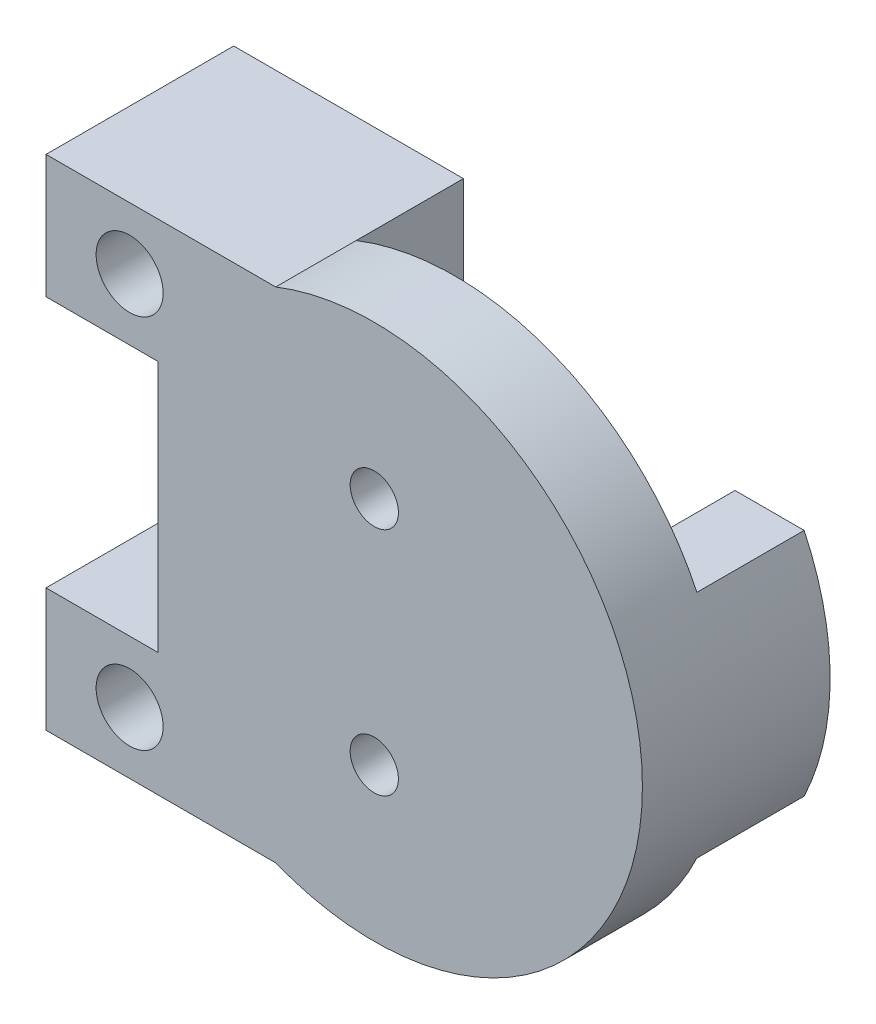
ISO-10303-21;
HEADER;
FILE_DESCRIPTION(('STEP AP214'),'2;1');
FILE_NAME('part.step','',(''),(''),'','','');
FILE_SCHEMA(('AUTOMOTIVE_DESIGN { 1 0 10303 214 1 1 1 1 }'));
ENDSEC;
DATA;
#1=APPLICATION_CONTEXT('core data for automotive mechanical design processes');
#2=APPLICATION_PROTOCOL_DEFINITION('international standard','automotive_design',2000,#1);
#3=PRODUCT_CONTEXT('',#1,'mechanical');
#4=PRODUCT('Part','Part','',(#3));
#5=PRODUCT_RELATED_PRODUCT_CATEGORY('part','',(#4));
#6=PRODUCT_DEFINITION_FORMATION('','',#4);
#7=PRODUCT_DEFINITION_CONTEXT('part definition',#1,'design');
#8=PRODUCT_DEFINITION('design','',#6,#7);
#9=PRODUCT_DEFINITION_SHAPE('','',#8);
#10=(LENGTH_UNIT() NAMED_UNIT(*) SI_UNIT(.MILLI.,.METRE.));
#11=(NAMED_UNIT(*) PLANE_ANGLE_UNIT() SI_UNIT($,.RADIAN.));
#12=(NAMED_UNIT(*) SI_UNIT($,.STERADIAN.) SOLID_ANGLE_UNIT());
#13=UNCERTAINTY_MEASURE_WITH_UNIT(LENGTH_MEASURE(1.E-05),#10,'distance_accuracy_value','');
#14=(GEOMETRIC_REPRESENTATION_CONTEXT(3) GLOBAL_UNCERTAINTY_ASSIGNED_CONTEXT((#13)) GLOBAL_UNIT_ASSIGNED_CONTEXT((#10,
#11,#12)) REPRESENTATION_CONTEXT('',''));
#15=CARTESIAN_POINT('',(0.,0.,0.));
#16=DIRECTION('',(0.,0.,1.));
#17=DIRECTION('',(1.,0.,0.));
#18=AXIS2_PLACEMENT_3D('',#15,#16,#17);
#19=CARTESIAN_POINT('',(-19.6111467499146,27.8877688433513,0.));
#20=DIRECTION('',(0.,0.,1.));
#21=DIRECTION('',(1.,0.,0.));
#22=AXIS2_PLACEMENT_3D('',#19,#20,#21);
#23=PLANE('',#22);
#24=CARTESIAN_POINT('',(-19.6111467499146,23.5877688433513,0.));
#25=DIRECTION('',(0.,0.,1.));
#26=DIRECTION('',(1.,0.,0.));
#27=AXIS2_PLACEMENT_3D('',#24,#25,#26);
#28=CIRCLE('',#27,0.900000000000001);
#29=CARTESIAN_POINT('',(-18.7111467499146,23.5877688433513,0.));
#30=VERTEX_POINT('',#29);
#31=EDGE_CURVE('E380',#30,#30,#28,.T.);
#32=ORIENTED_EDGE('',*,*,#31,.T.);
#33=EDGE_LOOP('',(#32));
#34=FACE_BOUND('',#33,.T.);
#35=CARTESIAN_POINT('',(-19.6111467499146,32.1877688433513,0.));
#36=DIRECTION('',(0.,0.,1.));
#37=DIRECTION('',(1.,0.,0.));
#38=AXIS2_PLACEMENT_3D('',#35,#36,#37);
#39=CIRCLE('',#38,0.9);
#40=CARTESIAN_POINT('',(-18.7111467499146,32.1877688433513,0.));
#41=VERTEX_POINT('',#40);
#42=EDGE_CURVE('E386',#41,#41,#39,.T.);
#43=ORIENTED_EDGE('',*,*,#42,.T.);
#44=EDGE_LOOP('',(#43));
#45=FACE_BOUND('',#44,.T.);
#46=CARTESIAN_POINT('',(-15.2591886094127,23.9877688433513,0.));
#47=DIRECTION('',(0.,0.,1.));
#48=DIRECTION('',(1.,0.,0.));
#49=AXIS2_PLACEMENT_3D('',#46,#47,#48);
#50=CIRCLE('',#49,1.4);
#51=CARTESIAN_POINT('',(-13.8591886094127,23.9877688433513,0.));
#52=VERTEX_POINT('',#51);
#53=EDGE_CURVE('E365',#52,#52,#50,.T.);
#54=ORIENTED_EDGE('',*,*,#53,.T.);
#55=EDGE_LOOP('',(#54));
#56=FACE_BOUND('',#55,.T.);
#57=CARTESIAN_POINT('',(-15.2591886094127,31.7877688433513,0.));
#58=DIRECTION('',(0.,0.,1.));
#59=DIRECTION('',(1.,0.,0.));
#60=AXIS2_PLACEMENT_3D('',#57,#58,#59);
#61=CIRCLE('',#60,1.4);
#62=CARTESIAN_POINT('',(-13.8591886094127,31.7877688433513,0.));
#63=VERTEX_POINT('',#62);
#64=EDGE_CURVE('E359',#63,#63,#61,.T.);
#65=ORIENTED_EDGE('',*,*,#64,.T.);
#66=EDGE_LOOP('',(#65));
#67=FACE_BOUND('',#66,.T.);
#68=DIRECTION('',(-1.,0.,0.));
#69=VECTOR('',#68,1.);
#70=CARTESIAN_POINT('',(-10.5789692824355,23.5959428687848,0.));
#71=LINE('',#70,#69);
#72=CARTESIAN_POINT('',(-10.5789692824355,23.5959428687848,0.));
#73=VERTEX_POINT('',#72);
#74=CARTESIAN_POINT('',(-13.1580289140126,23.5959428687848,0.));
#75=VERTEX_POINT('',#74);
#76=EDGE_CURVE('E683',#73,#75,#71,.T.);
#77=ORIENTED_EDGE('',*,*,#76,.F.);
#78=CARTESIAN_POINT('',(-19.6111467499146,27.8877688433513,0.));
#79=DIRECTION('',(0.,0.,1.));
#80=DIRECTION('',(1.,0.,0.));
#81=AXIS2_PLACEMENT_3D('',#78,#79,#80);
#82=CIRCLE('',#81,10.);
#83=CARTESIAN_POINT('',(-23.2867419398124,18.5877688433513,0.));
#84=VERTEX_POINT('',#83);
#85=EDGE_CURVE('E293',#84,#73,#82,.T.);
#86=ORIENTED_EDGE('',*,*,#85,.F.);
#87=DIRECTION('',(0.,-1.,0.));
#88=VECTOR('',#87,1.);
#89=CARTESIAN_POINT('',(-23.2867419398124,23.1877688433513,0.));
#90=LINE('',#89,#88);
#91=CARTESIAN_POINT('',(-23.2867419398124,23.1877688433513,0.));
#92=VERTEX_POINT('',#91);
#93=EDGE_CURVE('E164',#92,#84,#90,.T.);
#94=ORIENTED_EDGE('',*,*,#93,.F.);
#95=DIRECTION('',(1.,0.,0.));
#96=VECTOR('',#95,1.);
#97=CARTESIAN_POINT('',(-31.8520857071376,23.1877688433513,0.));
#98=LINE('',#97,#96);
#99=CARTESIAN_POINT('',(-24.6102760801051,23.1877688433513,0.));
#100=VERTEX_POINT('',#99);
#101=EDGE_CURVE('E297',#100,#92,#98,.T.);
#102=ORIENTED_EDGE('',*,*,#101,.F.);
#103=CARTESIAN_POINT('',(-25.7591886094127,23.9877688433513,0.));
#104=DIRECTION('',(0.,0.,1.));
#105=DIRECTION('',(1.,0.,0.));
#106=AXIS2_PLACEMENT_3D('',#103,#104,#105);
#107=CIRCLE('',#106,1.4);
#108=CARTESIAN_POINT('',(-26.9081011387203,23.1877688433513,0.));
#109=VERTEX_POINT('',#108);
#110=EDGE_CURVE('E371',#100,#109,#107,.T.);
#111=ORIENTED_EDGE('',*,*,#110,.T.);
#112=CARTESIAN_POINT('',(-27.669115572211,23.1877688433513,0.));
#113=VERTEX_POINT('',#112);
#114=EDGE_CURVE('E315',#113,#109,#98,.T.);
#115=ORIENTED_EDGE('',*,*,#114,.F.);
#116=DIRECTION('',(0.,-1.,0.));
#117=VECTOR('',#116,1.);
#118=CARTESIAN_POINT('',(-27.669115572211,32.5877688433513,0.));
#119=LINE('',#118,#117);
#120=CARTESIAN_POINT('',(-27.669115572211,32.5877688433513,0.));
#121=VERTEX_POINT('',#120);
#122=EDGE_CURVE('E405',#121,#113,#119,.T.);
#123=ORIENTED_EDGE('',*,*,#122,.F.);
#124=DIRECTION('',(-1.,0.,0.));
#125=VECTOR('',#124,1.);
#126=CARTESIAN_POINT('',(-23.2867419398124,32.5877688433513,0.));
#127=LINE('',#126,#125);
#128=CARTESIAN_POINT('',(-26.9081011387203,32.5877688433513,0.));
#129=VERTEX_POINT('',#128);
#130=EDGE_CURVE('E330',#129,#121,#127,.T.);
#131=ORIENTED_EDGE('',*,*,#130,.F.);
#132=CARTESIAN_POINT('',(-25.7591886094127,31.7877688433513,0.));
#133=DIRECTION('',(0.,0.,1.));
#134=DIRECTION('',(1.,0.,0.));
#135=AXIS2_PLACEMENT_3D('',#132,#133,#134);
#136=CIRCLE('',#135,1.4);
#137=CARTESIAN_POINT('',(-24.6102760801051,32.5877688433513,0.));
#138=VERTEX_POINT('',#137);
#139=EDGE_CURVE('E374',#129,#138,#136,.T.);
#140=ORIENTED_EDGE('',*,*,#139,.T.);
#141=CARTESIAN_POINT('',(-23.2867419398124,32.5877688433513,0.));
#142=VERTEX_POINT('',#141);
#143=EDGE_CURVE('E343',#142,#138,#127,.T.);
#144=ORIENTED_EDGE('',*,*,#143,.F.);
#145=DIRECTION('',(0.,-1.,0.));
#146=VECTOR('',#145,1.);
#147=CARTESIAN_POINT('',(-23.2867419398124,37.1877688433513,0.));
#148=LINE('',#147,#146);
#149=CARTESIAN_POINT('',(-23.2867419398124,37.1877688433513,0.));
#150=VERTEX_POINT('',#149);
#151=EDGE_CURVE('E335',#150,#142,#148,.T.);
#152=ORIENTED_EDGE('',*,*,#151,.F.);
#153=CARTESIAN_POINT('',(-10.5789692824355,32.1795948179178,0.));
#154=VERTEX_POINT('',#153);
#155=EDGE_CURVE('E400',#154,#150,#82,.T.);
#156=ORIENTED_EDGE('',*,*,#155,.F.);
#157=DIRECTION('',(1.,0.,0.));
#158=VECTOR('',#157,1.);
#159=CARTESIAN_POINT('',(-10.5789692824356,32.1795948179178,0.));
#160=LINE('',#159,#158);
#161=CARTESIAN_POINT('',(-13.1580289140126,32.1795948179178,0.));
#162=VERTEX_POINT('',#161);
#163=EDGE_CURVE('E289',#162,#154,#160,.T.);
#164=ORIENTED_EDGE('',*,*,#163,.F.);
#165=CARTESIAN_POINT('',(-19.6111467499146,27.8877688433513,0.));
#166=DIRECTION('',(0.,0.,1.));
#167=DIRECTION('',(1.,0.,0.));
#168=AXIS2_PLACEMENT_3D('',#165,#166,#167);
#169=CIRCLE('',#168,7.75);
#170=EDGE_CURVE('E681',#75,#162,#169,.T.);
#171=ORIENTED_EDGE('',*,*,#170,.F.);
#172=EDGE_LOOP('',(#77,#86,#94,#102,#111,#115,#123,#131,#140,#144,#152,#156,#164,#171));
#173=FACE_BOUND('',#172,.T.);
#174=ADVANCED_FACE('F141',(#34,#45,#56,#67,#173),#23,.F.);
#175=CARTESIAN_POINT('',(-25.7591886094127,23.9877688433513,-1.));
#176=DIRECTION('',(0.,0.,1.));
#177=DIRECTION('',(1.,0.,0.));
#178=AXIS2_PLACEMENT_3D('',#175,#176,#177);
#179=CYLINDRICAL_SURFACE('',#178,1.4);
#180=ORIENTED_EDGE('',*,*,#110,.F.);
#181=DIRECTION('',(0.,0.,1.));
#182=VECTOR('',#181,1.);
#183=CARTESIAN_POINT('',(-24.6102760801051,23.1877688433513,-1.));
#184=LINE('',#183,#182);
#185=CARTESIAN_POINT('',(-24.6102760801051,23.1877688433513,-1.));
#186=VERTEX_POINT('',#185);
#187=EDGE_CURVE('E324',#100,#186,#184,.F.);
#188=ORIENTED_EDGE('',*,*,#187,.T.);
#189=CARTESIAN_POINT('',(-25.7591886094127,23.9877688433513,-1.));
#190=DIRECTION('',(0.,0.,1.));
#191=DIRECTION('',(1.,0.,0.));
#192=AXIS2_PLACEMENT_3D('',#189,#190,#191);
#193=CIRCLE('',#192,1.4);
#194=CARTESIAN_POINT('',(-26.9081011387203,23.1877688433513,-1.));
#195=VERTEX_POINT('',#194);
#196=EDGE_CURVE('E368',#186,#195,#193,.T.);
#197=ORIENTED_EDGE('',*,*,#196,.T.);
#198=DIRECTION('',(0.,0.,1.));
#199=VECTOR('',#198,1.);
#200=CARTESIAN_POINT('',(-26.9081011387203,23.1877688433513,-1.));
#201=LINE('',#200,#199);
#202=EDGE_CURVE('E322',#195,#109,#201,.T.);
#203=ORIENTED_EDGE('',*,*,#202,.T.);
#204=EDGE_LOOP('',(#180,#188,#197,#203));
#205=FACE_BOUND('',#204,.T.);
#206=ADVANCED_FACE('F489',(#205),#179,.T.);
#207=CARTESIAN_POINT('',(-25.7591886094127,23.9877688433513,-1.));
#208=DIRECTION('',(0.,0.,1.));
#209=DIRECTION('',(1.,0.,0.));
#210=AXIS2_PLACEMENT_3D('',#207,#208,#209);
#211=PLANE('',#210);
#212=DIRECTION('',(1.,0.,0.));
#213=VECTOR('',#212,1.);
#214=CARTESIAN_POINT('',(-25.7591886094127,23.1877688433513,-1.));
#215=LINE('',#214,#213);
#216=EDGE_CURVE('E12',#195,#186,#215,.T.);
#217=ORIENTED_EDGE('',*,*,#216,.F.);
#218=ORIENTED_EDGE('',*,*,#196,.F.);
#219=EDGE_LOOP('',(#217,#218));
#220=FACE_BOUND('',#219,.T.);
#221=ADVANCED_FACE('F532',(#220),#211,.F.);
#222=CARTESIAN_POINT('',(-25.7591886094127,31.7877688433513,-1.));
#223=DIRECTION('',(0.,0.,1.));
#224=DIRECTION('',(1.,0.,0.));
#225=AXIS2_PLACEMENT_3D('',#222,#223,#224);
#226=CYLINDRICAL_SURFACE('',#225,1.4);
#227=ORIENTED_EDGE('',*,*,#139,.F.);
#228=DIRECTION('',(0.,0.,1.));
#229=VECTOR('',#228,1.);
#230=CARTESIAN_POINT('',(-26.9081011387203,32.5877688433513,-1.));
#231=LINE('',#230,#229);
#232=CARTESIAN_POINT('',(-26.9081011387203,32.5877688433513,-1.));
#233=VERTEX_POINT('',#232);
#234=EDGE_CURVE('E355',#129,#233,#231,.F.);
#235=ORIENTED_EDGE('',*,*,#234,.T.);
#236=CARTESIAN_POINT('',(-25.7591886094127,31.7877688433513,-1.));
#237=DIRECTION('',(0.,0.,1.));
#238=DIRECTION('',(1.,0.,0.));
#239=AXIS2_PLACEMENT_3D('',#236,#237,#238);
#240=CIRCLE('',#239,1.4);
#241=CARTESIAN_POINT('',(-24.6102760801051,32.5877688433513,-1.));
#242=VERTEX_POINT('',#241);
#243=EDGE_CURVE('E377',#233,#242,#240,.T.);
#244=ORIENTED_EDGE('',*,*,#243,.T.);
#245=DIRECTION('',(0.,0.,1.));
#246=VECTOR('',#245,1.);
#247=CARTESIAN_POINT('',(-24.6102760801051,32.5877688433513,-1.));
#248=LINE('',#247,#246);
#249=EDGE_CURVE('E353',#242,#138,#248,.T.);
#250=ORIENTED_EDGE('',*,*,#249,.T.);
#251=EDGE_LOOP('',(#227,#235,#244,#250));
#252=FACE_BOUND('',#251,.T.);
#253=ADVANCED_FACE('F449',(#252),#226,.T.);
#254=CARTESIAN_POINT('',(-25.7591886094127,31.7877688433513,-1.));
#255=DIRECTION('',(0.,0.,1.));
#256=DIRECTION('',(1.,0.,0.));
#257=AXIS2_PLACEMENT_3D('',#254,#255,#256);
#258=PLANE('',#257);
#259=DIRECTION('',(-1.,0.,0.));
#260=VECTOR('',#259,1.);
#261=CARTESIAN_POINT('',(-25.7591886094127,32.5877688433513,-1.));
#262=LINE('',#261,#260);
#263=EDGE_CURVE('E149',#242,#233,#262,.T.);
#264=ORIENTED_EDGE('',*,*,#263,.F.);
#265=ORIENTED_EDGE('',*,*,#243,.F.);
#266=EDGE_LOOP('',(#264,#265));
#267=FACE_BOUND('',#266,.T.);
#268=ADVANCED_FACE('F446',(#267),#258,.F.);
#269=CARTESIAN_POINT('',(-19.6111467499146,27.8877688433513,3.));
#270=DIRECTION('',(0.,0.,1.));
#271=DIRECTION('',(1.,0.,0.));
#272=AXIS2_PLACEMENT_3D('',#269,#270,#271);
#273=PLANE('',#272);
#274=CARTESIAN_POINT('',(-19.6111467499146,32.1877688433513,3.));
#275=DIRECTION('',(0.,0.,1.));
#276=DIRECTION('',(1.,0.,0.));
#277=AXIS2_PLACEMENT_3D('',#274,#275,#276);
#278=CIRCLE('',#277,0.9);
#279=CARTESIAN_POINT('',(-18.7111467499146,32.1877688433513,3.));
#280=VERTEX_POINT('',#279);
#281=EDGE_CURVE('E389',#280,#280,#278,.T.);
#282=ORIENTED_EDGE('',*,*,#281,.F.);
#283=EDGE_LOOP('',(#282));
#284=FACE_BOUND('',#283,.T.);
#285=CARTESIAN_POINT('',(-28.7352905453619,20.8877688433513,3.));
#286=DIRECTION('',(0.,0.,1.));
#287=DIRECTION('',(1.,0.,0.));
#288=AXIS2_PLACEMENT_3D('',#285,#286,#287);
#289=CIRCLE('',#288,1.25);
#290=CARTESIAN_POINT('',(-27.4852905453619,20.8877688433513,3.));
#291=VERTEX_POINT('',#290);
#292=EDGE_CURVE('E397',#291,#291,#289,.T.);
#293=ORIENTED_EDGE('',*,*,#292,.F.);
#294=EDGE_LOOP('',(#293));
#295=FACE_BOUND('',#294,.T.);
#296=DIRECTION('',(0.,-1.,0.));
#297=VECTOR('',#296,1.);
#298=CARTESIAN_POINT('',(-31.8520857071376,23.1877688433513,3.));
#299=LINE('',#298,#297);
#300=CARTESIAN_POINT('',(-31.8520857071376,23.1877688433513,3.));
#301=VERTEX_POINT('',#300);
#302=CARTESIAN_POINT('',(-31.8520857071376,18.5877688433513,3.));
#303=VERTEX_POINT('',#302);
#304=EDGE_CURVE('E401',#301,#303,#299,.T.);
#305=ORIENTED_EDGE('',*,*,#304,.T.);
#306=DIRECTION('',(1.,0.,0.));
#307=VECTOR('',#306,1.);
#308=CARTESIAN_POINT('',(-31.8520857071376,18.5877688433513,3.));
#309=LINE('',#308,#307);
#310=CARTESIAN_POINT('',(-23.2867419398124,18.5877688433513,3.));
#311=VERTEX_POINT('',#310);
#312=EDGE_CURVE('E404',#303,#311,#309,.T.);
#313=ORIENTED_EDGE('',*,*,#312,.T.);
#314=CARTESIAN_POINT('',(-19.6111467499146,27.8877688433513,3.));
#315=DIRECTION('',(0.,0.,1.));
#316=DIRECTION('',(1.,0.,0.));
#317=AXIS2_PLACEMENT_3D('',#314,#315,#316);
#318=CIRCLE('',#317,10.);
#319=CARTESIAN_POINT('',(-23.2867419398124,37.1877688433513,3.));
#320=VERTEX_POINT('',#319);
#321=EDGE_CURVE('E407',#311,#320,#318,.T.);
#322=ORIENTED_EDGE('',*,*,#321,.T.);
#323=DIRECTION('',(-1.,0.,0.));
#324=VECTOR('',#323,1.);
#325=CARTESIAN_POINT('',(-23.2867419398124,37.1877688433513,3.));
#326=LINE('',#325,#324);
#327=CARTESIAN_POINT('',(-31.8520857071376,37.1877688433513,3.));
#328=VERTEX_POINT('',#327);
#329=EDGE_CURVE('E409',#320,#328,#326,.T.);
#330=ORIENTED_EDGE('',*,*,#329,.T.);
#331=DIRECTION('',(0.,-1.,0.));
#332=VECTOR('',#331,1.);
#333=CARTESIAN_POINT('',(-31.8520857071376,37.1877688433513,3.));
#334=LINE('',#333,#332);
#335=CARTESIAN_POINT('',(-31.8520857071376,32.5877688433513,3.));
#336=VERTEX_POINT('',#335);
#337=EDGE_CURVE('E411',#328,#336,#334,.T.);
#338=ORIENTED_EDGE('',*,*,#337,.T.);
#339=DIRECTION('',(1.,0.,0.));
#340=VECTOR('',#339,1.);
#341=CARTESIAN_POINT('',(-31.8520857071376,32.5877688433513,3.));
#342=LINE('',#341,#340);
#343=CARTESIAN_POINT('',(-27.669115572211,32.5877688433513,3.));
#344=VERTEX_POINT('',#343);
#345=EDGE_CURVE('E413',#336,#344,#342,.T.);
#346=ORIENTED_EDGE('',*,*,#345,.T.);
#347=DIRECTION('',(0.,-1.,0.));
#348=VECTOR('',#347,1.);
#349=CARTESIAN_POINT('',(-27.669115572211,32.5877688433513,3.));
#350=LINE('',#349,#348);
#351=CARTESIAN_POINT('',(-27.669115572211,23.1877688433513,3.));
#352=VERTEX_POINT('',#351);
#353=EDGE_CURVE('E415',#344,#352,#350,.T.);
#354=ORIENTED_EDGE('',*,*,#353,.T.);
#355=DIRECTION('',(-1.,0.,0.));
#356=VECTOR('',#355,1.);
#357=CARTESIAN_POINT('',(-27.669115572211,23.1877688433513,3.));
#358=LINE('',#357,#356);
#359=EDGE_CURVE('E417',#352,#301,#358,.T.);
#360=ORIENTED_EDGE('',*,*,#359,.T.);
#361=EDGE_LOOP('',(#305,#313,#322,#330,#338,#346,#354,#360));
#362=FACE_BOUND('',#361,.T.);
#363=CARTESIAN_POINT('',(-28.7352905453619,34.8877688433513,3.));
#364=DIRECTION('',(0.,0.,1.));
#365=DIRECTION('',(1.,0.,0.));
#366=AXIS2_PLACEMENT_3D('',#363,#364,#365);
#367=CIRCLE('',#366,1.25);
#368=CARTESIAN_POINT('',(-27.4852905453619,34.8877688433513,3.));
#369=VERTEX_POINT('',#368);
#370=EDGE_CURVE('E392',#369,#369,#367,.T.);
#371=ORIENTED_EDGE('',*,*,#370,.F.);
#372=EDGE_LOOP('',(#371));
#373=FACE_BOUND('',#372,.T.);
#374=CARTESIAN_POINT('',(-19.6111467499146,23.5877688433513,3.));
#375=DIRECTION('',(0.,0.,1.));
#376=DIRECTION('',(1.,0.,0.));
#377=AXIS2_PLACEMENT_3D('',#374,#375,#376);
#378=CIRCLE('',#377,0.900000000000001);
#379=CARTESIAN_POINT('',(-18.7111467499146,23.5877688433513,3.));
#380=VERTEX_POINT('',#379);
#381=EDGE_CURVE('E383',#380,#380,#378,.T.);
#382=ORIENTED_EDGE('',*,*,#381,.F.);
#383=EDGE_LOOP('',(#382));
#384=FACE_BOUND('',#383,.T.);
#385=ADVANCED_FACE('F469',(#284,#295,#362,#373,#384),#273,.T.);
#386=CARTESIAN_POINT('',(-31.8520857071376,23.1877688433513,3.));
#387=DIRECTION('',(1.,0.,0.));
#388=DIRECTION('',(0.,0.,-1.));
#389=AXIS2_PLACEMENT_3D('',#386,#387,#388);
#390=PLANE('',#389);
#391=DIRECTION('',(0.,0.,-1.));
#392=VECTOR('',#391,1.);
#393=CARTESIAN_POINT('',(-31.8520857071376,23.1877688433513,3.));
#394=LINE('',#393,#392);
#395=CARTESIAN_POINT('',(-31.8520857071376,23.1877688433513,-4.));
#396=VERTEX_POINT('',#395);
#397=EDGE_CURVE('E419',#301,#396,#394,.T.);
#398=ORIENTED_EDGE('',*,*,#397,.T.);
#399=DIRECTION('',(0.,1.,0.));
#400=VECTOR('',#399,1.);
#401=CARTESIAN_POINT('',(-31.8520857071376,18.5877688433513,-4.));
#402=LINE('',#401,#400);
#403=CARTESIAN_POINT('',(-31.8520857071376,18.5877688433513,-4.));
#404=VERTEX_POINT('',#403);
#405=EDGE_CURVE('E303',#404,#396,#402,.T.);
#406=ORIENTED_EDGE('',*,*,#405,.F.);
#407=DIRECTION('',(0.,0.,-1.));
#408=VECTOR('',#407,1.);
#409=CARTESIAN_POINT('',(-31.8520857071376,18.5877688433513,3.));
#410=LINE('',#409,#408);
#411=EDGE_CURVE('E438',#303,#404,#410,.T.);
#412=ORIENTED_EDGE('',*,*,#411,.F.);
#413=ORIENTED_EDGE('',*,*,#304,.F.);
#414=EDGE_LOOP('',(#398,#406,#412,#413));
#415=FACE_BOUND('',#414,.T.);
#416=ADVANCED_FACE('F143',(#415),#390,.F.);
#417=CARTESIAN_POINT('',(-31.8520857071376,18.5877688433513,3.));
#418=DIRECTION('',(0.,1.,0.));
#419=DIRECTION('',(0.,0.,1.));
#420=AXIS2_PLACEMENT_3D('',#417,#418,#419);
#421=PLANE('',#420);
#422=ORIENTED_EDGE('',*,*,#411,.T.);
#423=DIRECTION('',(-1.,0.,0.));
#424=VECTOR('',#423,1.);
#425=CARTESIAN_POINT('',(-23.2867419398124,18.5877688433513,-4.));
#426=LINE('',#425,#424);
#427=CARTESIAN_POINT('',(-23.2867419398124,18.5877688433513,-4.));
#428=VERTEX_POINT('',#427);
#429=EDGE_CURVE('E310',#428,#404,#426,.T.);
#430=ORIENTED_EDGE('',*,*,#429,.F.);
#431=DIRECTION('',(0.,0.,1.));
#432=VECTOR('',#431,1.);
#433=CARTESIAN_POINT('',(-23.2867419398124,18.5877688433513,-4.));
#434=LINE('',#433,#432);
#435=EDGE_CURVE('E313',#428,#84,#434,.T.);
#436=ORIENTED_EDGE('',*,*,#435,.T.);
#437=DIRECTION('',(0.,0.,-1.));
#438=VECTOR('',#437,1.);
#439=CARTESIAN_POINT('',(-23.2867419398124,18.5877688433513,3.));
#440=LINE('',#439,#438);
#441=EDGE_CURVE('E436',#311,#84,#440,.T.);
#442=ORIENTED_EDGE('',*,*,#441,.F.);
#443=ORIENTED_EDGE('',*,*,#312,.F.);
#444=EDGE_LOOP('',(#422,#430,#436,#442,#443));
#445=FACE_BOUND('',#444,.T.);
#446=ADVANCED_FACE('F474',(#445),#421,.F.);
#447=CARTESIAN_POINT('',(-19.6111467499146,27.8877688433513,3.));
#448=DIRECTION('',(0.,0.,-1.));
#449=DIRECTION('',(-1.,0.,0.));
#450=AXIS2_PLACEMENT_3D('',#447,#448,#449);
#451=CYLINDRICAL_SURFACE('',#450,10.);
#452=ORIENTED_EDGE('',*,*,#85,.T.);
#453=DIRECTION('',(0.,0.,1.));
#454=VECTOR('',#453,1.);
#455=CARTESIAN_POINT('',(-10.5789692824355,23.5959428687848,-4.));
#456=LINE('',#455,#454);
#457=CARTESIAN_POINT('',(-10.5789692824355,23.5959428687848,-4.));
#458=VERTEX_POINT('',#457);
#459=EDGE_CURVE('E277',#458,#73,#456,.T.);
#460=ORIENTED_EDGE('',*,*,#459,.F.);
#461=CARTESIAN_POINT('',(-19.6111467499146,27.8877688433513,-4.));
#462=DIRECTION('',(0.,0.,-1.));
#463=DIRECTION('',(-1.,0.,0.));
#464=AXIS2_PLACEMENT_3D('',#461,#462,#463);
#465=CIRCLE('',#464,10.);
#466=CARTESIAN_POINT('',(-10.5789692824356,32.1795948179178,-4.));
#467=VERTEX_POINT('',#466);
#468=EDGE_CURVE('E284',#467,#458,#465,.T.);
#469=ORIENTED_EDGE('',*,*,#468,.F.);
#470=DIRECTION('',(0.,0.,1.));
#471=VECTOR('',#470,1.);
#472=CARTESIAN_POINT('',(-10.5789692824356,32.1795948179178,-4.));
#473=LINE('',#472,#471);
#474=EDGE_CURVE('E156',#467,#154,#473,.T.);
#475=ORIENTED_EDGE('',*,*,#474,.T.);
#476=ORIENTED_EDGE('',*,*,#155,.T.);
#477=DIRECTION('',(0.,0.,-1.));
#478=VECTOR('',#477,1.);
#479=CARTESIAN_POINT('',(-23.2867419398124,37.1877688433513,3.));
#480=LINE('',#479,#478);
#481=EDGE_CURVE('E433',#320,#150,#480,.T.);
#482=ORIENTED_EDGE('',*,*,#481,.F.);
#483=ORIENTED_EDGE('',*,*,#321,.F.);
#484=ORIENTED_EDGE('',*,*,#441,.T.);
#485=EDGE_LOOP('',(#452,#460,#469,#475,#476,#482,#483,#484));
#486=FACE_BOUND('',#485,.T.);
#487=ADVANCED_FACE('F292',(#486),#451,.T.);
#488=CARTESIAN_POINT('',(-23.2867419398124,37.1877688433513,3.));
#489=DIRECTION('',(0.,-1.,0.));
#490=DIRECTION('',(0.,0.,-1.));
#491=AXIS2_PLACEMENT_3D('',#488,#489,#490);
#492=PLANE('',#491);
#493=ORIENTED_EDGE('',*,*,#481,.T.);
#494=DIRECTION('',(0.,0.,1.));
#495=VECTOR('',#494,1.);
#496=CARTESIAN_POINT('',(-23.2867419398124,37.1877688433513,-4.));
#497=LINE('',#496,#495);
#498=CARTESIAN_POINT('',(-23.2867419398124,37.1877688433513,-4.));
#499=VERTEX_POINT('',#498);
#500=EDGE_CURVE('E350',#499,#150,#497,.T.);
#501=ORIENTED_EDGE('',*,*,#500,.F.);
#502=DIRECTION('',(1.,0.,0.));
#503=VECTOR('',#502,1.);
#504=CARTESIAN_POINT('',(-31.8520857071376,37.1877688433513,-4.));
#505=LINE('',#504,#503);
#506=CARTESIAN_POINT('',(-31.8520857071376,37.1877688433513,-4.));
#507=VERTEX_POINT('',#506);
#508=EDGE_CURVE('E338',#507,#499,#505,.T.);
#509=ORIENTED_EDGE('',*,*,#508,.F.);
#510=DIRECTION('',(0.,0.,-1.));
#511=VECTOR('',#510,1.);
#512=CARTESIAN_POINT('',(-31.8520857071376,37.1877688433513,3.));
#513=LINE('',#512,#511);
#514=EDGE_CURVE('E431',#328,#507,#513,.T.);
#515=ORIENTED_EDGE('',*,*,#514,.F.);
#516=ORIENTED_EDGE('',*,*,#329,.F.);
#517=EDGE_LOOP('',(#493,#501,#509,#515,#516));
#518=FACE_BOUND('',#517,.T.);
#519=ADVANCED_FACE('F463',(#518),#492,.F.);
#520=CARTESIAN_POINT('',(-31.8520857071376,37.1877688433513,3.));
#521=DIRECTION('',(1.,0.,0.));
#522=DIRECTION('',(0.,0.,-1.));
#523=AXIS2_PLACEMENT_3D('',#520,#521,#522);
#524=PLANE('',#523);
#525=ORIENTED_EDGE('',*,*,#514,.T.);
#526=DIRECTION('',(0.,1.,0.));
#527=VECTOR('',#526,1.);
#528=CARTESIAN_POINT('',(-31.8520857071376,32.5877688433513,-4.));
#529=LINE('',#528,#527);
#530=CARTESIAN_POINT('',(-31.8520857071376,32.5877688433513,-4.));
#531=VERTEX_POINT('',#530);
#532=EDGE_CURVE('E334',#531,#507,#529,.T.);
#533=ORIENTED_EDGE('',*,*,#532,.F.);
#534=DIRECTION('',(0.,0.,-1.));
#535=VECTOR('',#534,1.);
#536=CARTESIAN_POINT('',(-31.8520857071376,32.5877688433513,3.));
#537=LINE('',#536,#535);
#538=EDGE_CURVE('E429',#336,#531,#537,.T.);
#539=ORIENTED_EDGE('',*,*,#538,.F.);
#540=ORIENTED_EDGE('',*,*,#337,.F.);
#541=EDGE_LOOP('',(#525,#533,#539,#540));
#542=FACE_BOUND('',#541,.T.);
#543=ADVANCED_FACE('F502',(#542),#524,.F.);
#544=CARTESIAN_POINT('',(-31.8520857071376,32.5877688433513,3.));
#545=DIRECTION('',(0.,1.,0.));
#546=DIRECTION('',(0.,0.,1.));
#547=AXIS2_PLACEMENT_3D('',#544,#545,#546);
#548=PLANE('',#547);
#549=ORIENTED_EDGE('',*,*,#538,.T.);
#550=DIRECTION('',(-1.,0.,0.));
#551=VECTOR('',#550,1.);
#552=CARTESIAN_POINT('',(-23.2867419398124,32.5877688433513,-4.));
#553=LINE('',#552,#551);
#554=CARTESIAN_POINT('',(-23.2867419398124,32.5877688433513,-4.));
#555=VERTEX_POINT('',#554);
#556=EDGE_CURVE('E331',#555,#531,#553,.T.);
#557=ORIENTED_EDGE('',*,*,#556,.F.);
#558=DIRECTION('',(0.,0.,1.));
#559=VECTOR('',#558,1.);
#560=CARTESIAN_POINT('',(-23.2867419398124,32.5877688433513,-4.));
#561=LINE('',#560,#559);
#562=EDGE_CURVE('E342',#555,#142,#561,.T.);
#563=ORIENTED_EDGE('',*,*,#562,.T.);
#564=ORIENTED_EDGE('',*,*,#143,.T.);
#565=ORIENTED_EDGE('',*,*,#249,.F.);
#566=ORIENTED_EDGE('',*,*,#263,.T.);
#567=ORIENTED_EDGE('',*,*,#234,.F.);
#568=ORIENTED_EDGE('',*,*,#130,.T.);
#569=DIRECTION('',(0.,0.,-1.));
#570=VECTOR('',#569,1.);
#571=CARTESIAN_POINT('',(-27.669115572211,32.5877688433513,3.));
#572=LINE('',#571,#570);
#573=EDGE_CURVE('E427',#344,#121,#572,.T.);
#574=ORIENTED_EDGE('',*,*,#573,.F.);
#575=ORIENTED_EDGE('',*,*,#345,.F.);
#576=EDGE_LOOP('',(#549,#557,#563,#564,#565,#566,#567,#568,#574,#575));
#577=FACE_BOUND('',#576,.T.);
#578=ADVANCED_FACE('F443',(#577),#548,.F.);
#579=CARTESIAN_POINT('',(-27.669115572211,32.5877688433513,3.));
#580=DIRECTION('',(1.,0.,0.));
#581=DIRECTION('',(0.,1.,0.));
#582=AXIS2_PLACEMENT_3D('',#579,#580,#581);
#583=PLANE('',#582);
#584=ORIENTED_EDGE('',*,*,#122,.T.);
#585=DIRECTION('',(0.,0.,-1.));
#586=VECTOR('',#585,1.);
#587=CARTESIAN_POINT('',(-27.669115572211,23.1877688433513,3.));
#588=LINE('',#587,#586);
#589=EDGE_CURVE('E424',#352,#113,#588,.T.);
#590=ORIENTED_EDGE('',*,*,#589,.F.);
#591=ORIENTED_EDGE('',*,*,#353,.F.);
#592=ORIENTED_EDGE('',*,*,#573,.T.);
#593=EDGE_LOOP('',(#584,#590,#591,#592));
#594=FACE_BOUND('',#593,.T.);
#595=ADVANCED_FACE('F494',(#594),#583,.F.);
#596=CARTESIAN_POINT('',(-27.669115572211,23.1877688433513,3.));
#597=DIRECTION('',(0.,-1.,0.));
#598=DIRECTION('',(0.,0.,-1.));
#599=AXIS2_PLACEMENT_3D('',#596,#597,#598);
#600=PLANE('',#599);
#601=ORIENTED_EDGE('',*,*,#589,.T.);
#602=ORIENTED_EDGE('',*,*,#114,.T.);
#603=ORIENTED_EDGE('',*,*,#202,.F.);
#604=ORIENTED_EDGE('',*,*,#216,.T.);
#605=ORIENTED_EDGE('',*,*,#187,.F.);
#606=ORIENTED_EDGE('',*,*,#101,.T.);
#607=DIRECTION('',(0.,0.,1.));
#608=VECTOR('',#607,1.);
#609=CARTESIAN_POINT('',(-23.2867419398124,23.1877688433513,-4.));
#610=LINE('',#609,#608);
#611=CARTESIAN_POINT('',(-23.2867419398124,23.1877688433513,-4.));
#612=VERTEX_POINT('',#611);
#613=EDGE_CURVE('E319',#612,#92,#610,.T.);
#614=ORIENTED_EDGE('',*,*,#613,.F.);
#615=DIRECTION('',(1.,0.,0.));
#616=VECTOR('',#615,1.);
#617=CARTESIAN_POINT('',(-31.8520857071376,23.1877688433513,-4.));
#618=LINE('',#617,#616);
#619=EDGE_CURVE('E306',#396,#612,#618,.T.);
#620=ORIENTED_EDGE('',*,*,#619,.F.);
#621=ORIENTED_EDGE('',*,*,#397,.F.);
#622=ORIENTED_EDGE('',*,*,#359,.F.);
#623=EDGE_LOOP('',(#601,#602,#603,#604,#605,#606,#614,#620,#621,#622));
#624=FACE_BOUND('',#623,.T.);
#625=ADVANCED_FACE('F483',(#624),#600,.F.);
#626=CARTESIAN_POINT('',(-28.7352905453619,20.8877688433513,3.));
#627=DIRECTION('',(0.,0.,-1.));
#628=DIRECTION('',(-1.,0.,0.));
#629=AXIS2_PLACEMENT_3D('',#626,#627,#628);
#630=CYLINDRICAL_SURFACE('',#629,1.25);
#631=ORIENTED_EDGE('',*,*,#292,.T.);
#632=EDGE_LOOP('',(#631));
#633=FACE_BOUND('',#632,.T.);
#634=CARTESIAN_POINT('',(-28.7352905453619,20.8877688433513,-4.));
#635=DIRECTION('',(0.,0.,-1.));
#636=DIRECTION('',(-1.,0.,0.));
#637=AXIS2_PLACEMENT_3D('',#634,#635,#636);
#638=CIRCLE('',#637,1.25);
#639=CARTESIAN_POINT('',(-29.9852905453619,20.8877688433513,-4.));
#640=VERTEX_POINT('',#639);
#641=EDGE_CURVE('E294',#640,#640,#638,.T.);
#642=ORIENTED_EDGE('',*,*,#641,.T.);
#643=EDGE_LOOP('',(#642));
#644=FACE_BOUND('',#643,.T.);
#645=ADVANCED_FACE('F514',(#633,#644),#630,.F.);
#646=CARTESIAN_POINT('',(-28.7352905453619,34.8877688433513,3.));
#647=DIRECTION('',(0.,0.,-1.));
#648=DIRECTION('',(-1.,0.,0.));
#649=AXIS2_PLACEMENT_3D('',#646,#647,#648);
#650=CYLINDRICAL_SURFACE('',#649,1.25);
#651=ORIENTED_EDGE('',*,*,#370,.T.);
#652=EDGE_LOOP('',(#651));
#653=FACE_BOUND('',#652,.T.);
#654=CARTESIAN_POINT('',(-28.7352905453619,34.8877688433513,-4.));
#655=DIRECTION('',(0.,0.,-1.));
#656=DIRECTION('',(-1.,0.,0.));
#657=AXIS2_PLACEMENT_3D('',#654,#655,#656);
#658=CIRCLE('',#657,1.25);
#659=CARTESIAN_POINT('',(-29.9852905453619,34.8877688433513,-4.));
#660=VERTEX_POINT('',#659);
#661=EDGE_CURVE('E327',#660,#660,#658,.T.);
#662=ORIENTED_EDGE('',*,*,#661,.T.);
#663=EDGE_LOOP('',(#662));
#664=FACE_BOUND('',#663,.T.);
#665=ADVANCED_FACE('F511',(#653,#664),#650,.F.);
#666=CARTESIAN_POINT('',(-19.6111467499146,32.1877688433513,3.));
#667=DIRECTION('',(0.,0.,-1.));
#668=DIRECTION('',(-1.,0.,0.));
#669=AXIS2_PLACEMENT_3D('',#666,#667,#668);
#670=CYLINDRICAL_SURFACE('',#669,0.9);
#671=ORIENTED_EDGE('',*,*,#281,.T.);
#672=EDGE_LOOP('',(#671));
#673=FACE_BOUND('',#672,.T.);
#674=ORIENTED_EDGE('',*,*,#42,.F.);
#675=EDGE_LOOP('',(#674));
#676=FACE_BOUND('',#675,.T.);
#677=ADVANCED_FACE('F513',(#673,#676),#670,.F.);
#678=CARTESIAN_POINT('',(-19.6111467499146,23.5877688433513,3.));
#679=DIRECTION('',(0.,0.,-1.));
#680=DIRECTION('',(-1.,0.,0.));
#681=AXIS2_PLACEMENT_3D('',#678,#679,#680);
#682=CYLINDRICAL_SURFACE('',#681,0.900000000000001);
#683=ORIENTED_EDGE('',*,*,#381,.T.);
#684=EDGE_LOOP('',(#683));
#685=FACE_BOUND('',#684,.T.);
#686=ORIENTED_EDGE('',*,*,#31,.F.);
#687=EDGE_LOOP('',(#686));
#688=FACE_BOUND('',#687,.T.);
#689=ADVANCED_FACE('F521',(#685,#688),#682,.F.);
#690=CARTESIAN_POINT('',(-15.2591886094127,23.9877688433513,-1.));
#691=DIRECTION('',(0.,0.,1.));
#692=DIRECTION('',(1.,0.,0.));
#693=AXIS2_PLACEMENT_3D('',#690,#691,#692);
#694=CYLINDRICAL_SURFACE('',#693,1.4);
#695=CARTESIAN_POINT('',(-15.2591886094127,23.9877688433513,-1.));
#696=DIRECTION('',(0.,0.,1.));
#697=DIRECTION('',(1.,0.,0.));
#698=AXIS2_PLACEMENT_3D('',#695,#696,#697);
#699=CIRCLE('',#698,1.4);
#700=CARTESIAN_POINT('',(-13.8591886094127,23.9877688433513,-1.));
#701=VERTEX_POINT('',#700);
#702=EDGE_CURVE('E362',#701,#701,#699,.T.);
#703=ORIENTED_EDGE('',*,*,#702,.T.);
#704=EDGE_LOOP('',(#703));
#705=FACE_BOUND('',#704,.T.);
#706=ORIENTED_EDGE('',*,*,#53,.F.);
#707=EDGE_LOOP('',(#706));
#708=FACE_BOUND('',#707,.T.);
#709=ADVANCED_FACE('F582',(#705,#708),#694,.T.);
#710=CARTESIAN_POINT('',(-15.2591886094127,23.9877688433513,-1.));
#711=DIRECTION('',(0.,0.,1.));
#712=DIRECTION('',(1.,0.,0.));
#713=AXIS2_PLACEMENT_3D('',#710,#711,#712);
#714=PLANE('',#713);
#715=ORIENTED_EDGE('',*,*,#702,.F.);
#716=EDGE_LOOP('',(#715));
#717=FACE_BOUND('',#716,.T.);
#718=ADVANCED_FACE('F577',(#717),#714,.F.);
#719=CARTESIAN_POINT('',(-15.2591886094127,31.7877688433513,-1.));
#720=DIRECTION('',(0.,0.,1.));
#721=DIRECTION('',(1.,0.,0.));
#722=AXIS2_PLACEMENT_3D('',#719,#720,#721);
#723=CYLINDRICAL_SURFACE('',#722,1.4);
#724=CARTESIAN_POINT('',(-15.2591886094127,31.7877688433513,-1.));
#725=DIRECTION('',(0.,0.,1.));
#726=DIRECTION('',(1.,0.,0.));
#727=AXIS2_PLACEMENT_3D('',#724,#725,#726);
#728=CIRCLE('',#727,1.4);
#729=CARTESIAN_POINT('',(-13.8591886094127,31.7877688433513,-1.));
#730=VERTEX_POINT('',#729);
#731=EDGE_CURVE('E358',#730,#730,#728,.T.);
#732=ORIENTED_EDGE('',*,*,#731,.T.);
#733=EDGE_LOOP('',(#732));
#734=FACE_BOUND('',#733,.T.);
#735=ORIENTED_EDGE('',*,*,#64,.F.);
#736=EDGE_LOOP('',(#735));
#737=FACE_BOUND('',#736,.T.);
#738=ADVANCED_FACE('F574',(#734,#737),#723,.T.);
#739=CARTESIAN_POINT('',(-15.2591886094127,31.7877688433513,-1.));
#740=DIRECTION('',(0.,0.,1.));
#741=DIRECTION('',(1.,0.,0.));
#742=AXIS2_PLACEMENT_3D('',#739,#740,#741);
#743=PLANE('',#742);
#744=ORIENTED_EDGE('',*,*,#731,.F.);
#745=EDGE_LOOP('',(#744));
#746=FACE_BOUND('',#745,.T.);
#747=ADVANCED_FACE('F507',(#746),#743,.F.);
#748=CARTESIAN_POINT('',(0.,0.,-4.));
#749=DIRECTION('',(0.,0.,-1.));
#750=DIRECTION('',(-1.,0.,0.));
#751=AXIS2_PLACEMENT_3D('',#748,#749,#750);
#752=PLANE('',#751);
#753=ORIENTED_EDGE('',*,*,#556,.T.);
#754=ORIENTED_EDGE('',*,*,#532,.T.);
#755=ORIENTED_EDGE('',*,*,#508,.T.);
#756=DIRECTION('',(0.,-1.,0.));
#757=VECTOR('',#756,1.);
#758=CARTESIAN_POINT('',(-23.2867419398124,37.1877688433513,-4.));
#759=LINE('',#758,#757);
#760=EDGE_CURVE('E340',#499,#555,#759,.T.);
#761=ORIENTED_EDGE('',*,*,#760,.T.);
#762=EDGE_LOOP('',(#753,#754,#755,#761));
#763=FACE_BOUND('',#762,.T.);
#764=ORIENTED_EDGE('',*,*,#661,.F.);
#765=EDGE_LOOP('',(#764));
#766=FACE_BOUND('',#765,.T.);
#767=ADVANCED_FACE('F504',(#763,#766),#752,.T.);
#768=CARTESIAN_POINT('',(-23.2867419398124,37.1877688433513,-4.));
#769=DIRECTION('',(-1.,0.,0.));
#770=DIRECTION('',(0.,0.,1.));
#771=AXIS2_PLACEMENT_3D('',#768,#769,#770);
#772=PLANE('',#771);
#773=ORIENTED_EDGE('',*,*,#151,.T.);
#774=ORIENTED_EDGE('',*,*,#562,.F.);
#775=ORIENTED_EDGE('',*,*,#760,.F.);
#776=ORIENTED_EDGE('',*,*,#500,.T.);
#777=EDGE_LOOP('',(#773,#774,#775,#776));
#778=FACE_BOUND('',#777,.T.);
#779=ADVANCED_FACE('F456',(#778),#772,.F.);
#780=CARTESIAN_POINT('',(0.,0.,-4.));
#781=DIRECTION('',(0.,0.,-1.));
#782=DIRECTION('',(-1.,0.,0.));
#783=AXIS2_PLACEMENT_3D('',#780,#781,#782);
#784=PLANE('',#783);
#785=ORIENTED_EDGE('',*,*,#405,.T.);
#786=ORIENTED_EDGE('',*,*,#619,.T.);
#787=DIRECTION('',(0.,-1.,0.));
#788=VECTOR('',#787,1.);
#789=CARTESIAN_POINT('',(-23.2867419398124,23.1877688433513,-4.));
#790=LINE('',#789,#788);
#791=EDGE_CURVE('E308',#612,#428,#790,.T.);
#792=ORIENTED_EDGE('',*,*,#791,.T.);
#793=ORIENTED_EDGE('',*,*,#429,.T.);
#794=EDGE_LOOP('',(#785,#786,#792,#793));
#795=FACE_BOUND('',#794,.T.);
#796=ORIENTED_EDGE('',*,*,#641,.F.);
#797=EDGE_LOOP('',(#796));
#798=FACE_BOUND('',#797,.T.);
#799=ADVANCED_FACE('F559',(#795,#798),#784,.T.);
#800=CARTESIAN_POINT('',(-23.2867419398124,23.1877688433513,-4.));
#801=DIRECTION('',(-1.,0.,0.));
#802=DIRECTION('',(0.,-1.,0.));
#803=AXIS2_PLACEMENT_3D('',#800,#801,#802);
#804=PLANE('',#803);
#805=ORIENTED_EDGE('',*,*,#93,.T.);
#806=ORIENTED_EDGE('',*,*,#435,.F.);
#807=ORIENTED_EDGE('',*,*,#791,.F.);
#808=ORIENTED_EDGE('',*,*,#613,.T.);
#809=EDGE_LOOP('',(#805,#806,#807,#808));
#810=FACE_BOUND('',#809,.T.);
#811=ADVANCED_FACE('F479',(#810),#804,.F.);
#812=CARTESIAN_POINT('',(-10.5789692824355,23.5959428687848,-4.));
#813=DIRECTION('',(0.,1.,0.));
#814=DIRECTION('',(-1.,0.,0.));
#815=AXIS2_PLACEMENT_3D('',#812,#813,#814);
#816=PLANE('',#815);
#817=ORIENTED_EDGE('',*,*,#76,.T.);
#818=DIRECTION('',(0.,0.,1.));
#819=VECTOR('',#818,1.);
#820=CARTESIAN_POINT('',(-13.1580289140126,23.5959428687848,-4.));
#821=LINE('',#820,#819);
#822=CARTESIAN_POINT('',(-13.1580289140126,23.5959428687848,-4.));
#823=VERTEX_POINT('',#822);
#824=EDGE_CURVE('E280',#823,#75,#821,.T.);
#825=ORIENTED_EDGE('',*,*,#824,.F.);
#826=DIRECTION('',(-1.,0.,0.));
#827=VECTOR('',#826,1.);
#828=CARTESIAN_POINT('',(-10.5789692824355,23.5959428687848,-4.));
#829=LINE('',#828,#827);
#830=EDGE_CURVE('E273',#458,#823,#829,.T.);
#831=ORIENTED_EDGE('',*,*,#830,.F.);
#832=ORIENTED_EDGE('',*,*,#459,.T.);
#833=EDGE_LOOP('',(#817,#825,#831,#832));
#834=FACE_BOUND('',#833,.T.);
#835=ADVANCED_FACE('F275',(#834),#816,.F.);
#836=CARTESIAN_POINT('',(-19.6111467499146,27.8877688433513,-4.));
#837=DIRECTION('',(0.,0.,1.));
#838=DIRECTION('',(1.,0.,0.));
#839=AXIS2_PLACEMENT_3D('',#836,#837,#838);
#840=CYLINDRICAL_SURFACE('',#839,7.75);
#841=ORIENTED_EDGE('',*,*,#170,.T.);
#842=DIRECTION('',(0.,0.,1.));
#843=VECTOR('',#842,1.);
#844=CARTESIAN_POINT('',(-13.1580289140126,32.1795948179178,-4.));
#845=LINE('',#844,#843);
#846=CARTESIAN_POINT('',(-13.1580289140126,32.1795948179178,-4.));
#847=VERTEX_POINT('',#846);
#848=EDGE_CURVE('E299',#847,#162,#845,.T.);
#849=ORIENTED_EDGE('',*,*,#848,.F.);
#850=CARTESIAN_POINT('',(-19.6111467499146,27.8877688433513,-4.));
#851=DIRECTION('',(0.,0.,1.));
#852=DIRECTION('',(1.,0.,0.));
#853=AXIS2_PLACEMENT_3D('',#850,#851,#852);
#854=CIRCLE('',#853,7.75);
#855=EDGE_CURVE('E283',#823,#847,#854,.T.);
#856=ORIENTED_EDGE('',*,*,#855,.F.);
#857=ORIENTED_EDGE('',*,*,#824,.T.);
#858=EDGE_LOOP('',(#841,#849,#856,#857));
#859=FACE_BOUND('',#858,.T.);
#860=ADVANCED_FACE('F649',(#859),#840,.F.);
#861=CARTESIAN_POINT('',(-10.5789692824356,32.1795948179178,-4.));
#862=DIRECTION('',(0.,-1.,0.));
#863=DIRECTION('',(1.,0.,0.));
#864=AXIS2_PLACEMENT_3D('',#861,#862,#863);
#865=PLANE('',#864);
#866=ORIENTED_EDGE('',*,*,#163,.T.);
#867=ORIENTED_EDGE('',*,*,#474,.F.);
#868=DIRECTION('',(1.,0.,0.));
#869=VECTOR('',#868,1.);
#870=CARTESIAN_POINT('',(-10.5789692824356,32.1795948179178,-4.));
#871=LINE('',#870,#869);
#872=EDGE_CURVE('E288',#847,#467,#871,.T.);
#873=ORIENTED_EDGE('',*,*,#872,.F.);
#874=ORIENTED_EDGE('',*,*,#848,.T.);
#875=EDGE_LOOP('',(#866,#867,#873,#874));
#876=FACE_BOUND('',#875,.T.);
#877=ADVANCED_FACE('F657',(#876),#865,.F.);
#878=CARTESIAN_POINT('',(-19.6111467499146,27.8877688433513,-4.));
#879=DIRECTION('',(0.,0.,-1.));
#880=DIRECTION('',(-1.,0.,0.));
#881=AXIS2_PLACEMENT_3D('',#878,#879,#880);
#882=PLANE('',#881);
#883=ORIENTED_EDGE('',*,*,#468,.T.);
#884=ORIENTED_EDGE('',*,*,#830,.T.);
#885=ORIENTED_EDGE('',*,*,#855,.T.);
#886=ORIENTED_EDGE('',*,*,#872,.T.);
#887=EDGE_LOOP('',(#883,#884,#885,#886));
#888=FACE_BOUND('',#887,.T.);
#889=ADVANCED_FACE('F286',(#888),#882,.T.);
#890=CLOSED_SHELL('',(#174,#206,#221,#253,#268,#385,#416,#446,#487,#519,#543,#578,#595,#625,
#645,#665,#677,#689,#709,#718,#738,#747,#767,#779,#799,#811,#835,#860,#877,#889));
#891=MANIFOLD_SOLID_BREP('B2',#890);
#892=ADVANCED_BREP_SHAPE_REPRESENTATION('',(#18,#891),#14);
#893=SHAPE_DEFINITION_REPRESENTATION(#9,#892);
ENDSEC;
END-ISO-10303-21;
